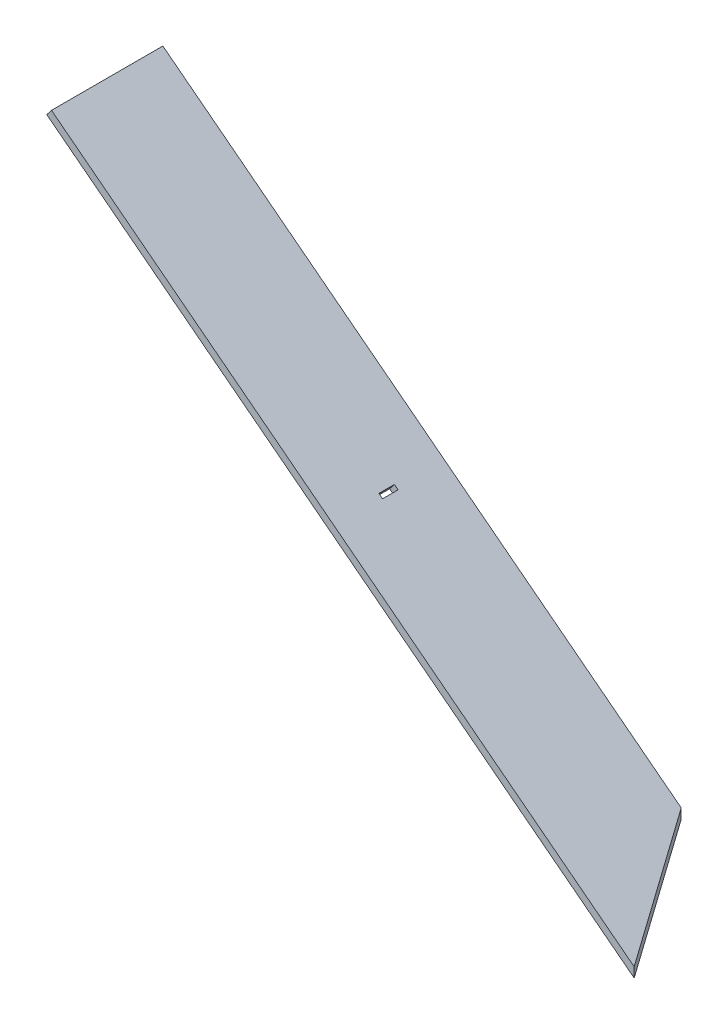
ISO-10303-21;
HEADER;
FILE_DESCRIPTION(('STEP AP214'),'2;1');
FILE_NAME('part.step','',(''),(''),'','','');
FILE_SCHEMA(('AUTOMOTIVE_DESIGN { 1 0 10303 214 1 1 1 1 }'));
ENDSEC;
DATA;
#1=APPLICATION_CONTEXT('core data for automotive mechanical design processes');
#2=APPLICATION_PROTOCOL_DEFINITION('international standard','automotive_design',2000,#1);
#3=PRODUCT_CONTEXT('',#1,'mechanical');
#4=PRODUCT('Part','Part','',(#3));
#5=PRODUCT_RELATED_PRODUCT_CATEGORY('part','',(#4));
#6=PRODUCT_DEFINITION_FORMATION('','',#4);
#7=PRODUCT_DEFINITION_CONTEXT('part definition',#1,'design');
#8=PRODUCT_DEFINITION('design','',#6,#7);
#9=PRODUCT_DEFINITION_SHAPE('','',#8);
#10=(LENGTH_UNIT() NAMED_UNIT(*) SI_UNIT(.MILLI.,.METRE.));
#11=(NAMED_UNIT(*) PLANE_ANGLE_UNIT() SI_UNIT($,.RADIAN.));
#12=(NAMED_UNIT(*) SI_UNIT($,.STERADIAN.) SOLID_ANGLE_UNIT());
#13=UNCERTAINTY_MEASURE_WITH_UNIT(LENGTH_MEASURE(1.E-05),#10,'distance_accuracy_value','');
#14=(GEOMETRIC_REPRESENTATION_CONTEXT(3) GLOBAL_UNCERTAINTY_ASSIGNED_CONTEXT((#13)) GLOBAL_UNIT_ASSIGNED_CONTEXT((#10,
#11,#12)) REPRESENTATION_CONTEXT('',''));
#15=CARTESIAN_POINT('',(0.,0.,0.));
#16=DIRECTION('',(0.,0.,1.));
#17=DIRECTION('',(1.,0.,0.));
#18=AXIS2_PLACEMENT_3D('',#15,#16,#17);
#19=CARTESIAN_POINT('',(0.,0.,-240.2));
#20=DIRECTION('',(-0.611527040185827,-0.791223532967493,0.));
#21=DIRECTION('',(0.791223532967493,-0.611527040185827,0.));
#22=AXIS2_PLACEMENT_3D('',#19,#20,#21);
#23=PLANE('',#22);
#24=DIRECTION('',(0.,0.,1.));
#25=VECTOR('',#24,1.);
#26=CARTESIAN_POINT('',(-196.842346713492,152.137054389003,-240.2));
#27=LINE('',#26,#25);
#28=CARTESIAN_POINT('',(-196.842346713492,152.137054389002,-209.17));
#29=VERTEX_POINT('',#28);
#30=CARTESIAN_POINT('',(-196.842346713492,152.137054389002,-199.17));
#31=VERTEX_POINT('',#30);
#32=EDGE_CURVE('E319',#29,#31,#27,.T.);
#33=ORIENTED_EDGE('',*,*,#32,.F.);
#34=DIRECTION('',(0.791223532967493,-0.611527040185827,0.));
#35=VECTOR('',#34,1.);
#36=CARTESIAN_POINT('',(0.,0.,-209.17));
#37=LINE('',#36,#35);
#38=CARTESIAN_POINT('',(-199.216017312395,153.97163550956,-209.17));
#39=VERTEX_POINT('',#38);
#40=EDGE_CURVE('E327',#39,#29,#37,.T.);
#41=ORIENTED_EDGE('',*,*,#40,.F.);
#42=DIRECTION('',(0.,0.,-1.));
#43=VECTOR('',#42,1.);
#44=CARTESIAN_POINT('',(-199.216017312395,153.97163550956,-240.2));
#45=LINE('',#44,#43);
#46=CARTESIAN_POINT('',(-199.216017312395,153.97163550956,-199.17));
#47=VERTEX_POINT('',#46);
#48=EDGE_CURVE('E261',#47,#39,#45,.T.);
#49=ORIENTED_EDGE('',*,*,#48,.F.);
#50=DIRECTION('',(-0.791223532967493,0.611527040185827,0.));
#51=VECTOR('',#50,1.);
#52=CARTESIAN_POINT('',(0.,0.,-199.17));
#53=LINE('',#52,#51);
#54=EDGE_CURVE('E322',#31,#47,#53,.T.);
#55=ORIENTED_EDGE('',*,*,#54,.F.);
#56=EDGE_LOOP('',(#33,#41,#49,#55));
#57=FACE_BOUND('',#56,.T.);
#58=DIRECTION('',(0.791223532967493,-0.611527040185827,0.));
#59=VECTOR('',#58,1.);
#60=CARTESIAN_POINT('',(0.,0.,-240.2));
#61=LINE('',#60,#59);
#62=CARTESIAN_POINT('',(-380.024662884291,293.716437401255,-240.2));
#63=VERTEX_POINT('',#62);
#64=CARTESIAN_POINT('',(-41.6038603978046,32.1551174216896,-240.2));
#65=VERTEX_POINT('',#64);
#66=EDGE_CURVE('E291',#63,#65,#61,.T.);
#67=ORIENTED_EDGE('',*,*,#66,.T.);
#68=DIRECTION('',(0.466386479127684,-0.360464434233857,0.807805077812307));
#69=VECTOR('',#68,1.);
#70=CARTESIAN_POINT('',(-27.1485593184527,20.9827911248499,-215.162684091857));
#71=LINE('',#70,#69);
#72=CARTESIAN_POINT('',(0.,0.,-168.14));
#73=VERTEX_POINT('',#72);
#74=EDGE_CURVE('E307',#65,#73,#71,.T.);
#75=ORIENTED_EDGE('',*,*,#74,.T.);
#76=DIRECTION('',(-0.791223532967494,0.611527040185827,0.));
#77=VECTOR('',#76,1.);
#78=CARTESIAN_POINT('',(0.,0.,-168.14));
#79=LINE('',#78,#77);
#80=CARTESIAN_POINT('',(-380.024662884291,293.716437401255,-168.14));
#81=VERTEX_POINT('',#80);
#82=EDGE_CURVE('E295',#73,#81,#79,.T.);
#83=ORIENTED_EDGE('',*,*,#82,.T.);
#84=DIRECTION('',(0.,0.,1.));
#85=VECTOR('',#84,1.);
#86=CARTESIAN_POINT('',(-380.024662884291,293.716437401255,-240.2));
#87=LINE('',#86,#85);
#88=EDGE_CURVE('E276',#63,#81,#87,.T.);
#89=ORIENTED_EDGE('',*,*,#88,.F.);
#90=EDGE_LOOP('',(#67,#75,#83,#89));
#91=FACE_BOUND('',#90,.T.);
#92=ADVANCED_FACE('F186',(#57,#91),#23,.T.);
#93=CARTESIAN_POINT('',(0.,6.31932670309673,-240.2));
#94=DIRECTION('',(0.611527040185827,0.791223532967494,0.));
#95=DIRECTION('',(-0.791223532967494,0.611527040185827,0.));
#96=AXIS2_PLACEMENT_3D('',#93,#94,#95);
#97=PLANE('',#96);
#98=DIRECTION('',(0.,0.,-1.));
#99=VECTOR('',#98,1.);
#100=CARTESIAN_POINT('',(-193.784711512563,156.09317205384,-240.2));
#101=LINE('',#100,#99);
#102=CARTESIAN_POINT('',(-193.784711512563,156.09317205384,-199.17));
#103=VERTEX_POINT('',#102);
#104=CARTESIAN_POINT('',(-193.784711512563,156.09317205384,-209.17));
#105=VERTEX_POINT('',#104);
#106=EDGE_CURVE('E13',#103,#105,#101,.T.);
#107=ORIENTED_EDGE('',*,*,#106,.F.);
#108=DIRECTION('',(0.791223532967494,-0.611527040185827,0.));
#109=VECTOR('',#108,1.);
#110=CARTESIAN_POINT('',(0.,6.31932670309673,-199.17));
#111=LINE('',#110,#109);
#112=CARTESIAN_POINT('',(-196.158382111466,157.927753174397,-199.17));
#113=VERTEX_POINT('',#112);
#114=EDGE_CURVE('E194',#113,#103,#111,.T.);
#115=ORIENTED_EDGE('',*,*,#114,.F.);
#116=DIRECTION('',(0.,0.,1.));
#117=VECTOR('',#116,1.);
#118=CARTESIAN_POINT('',(-196.158382111466,157.927753174397,-240.2));
#119=LINE('',#118,#117);
#120=CARTESIAN_POINT('',(-196.158382111466,157.927753174397,-209.17));
#121=VERTEX_POINT('',#120);
#122=EDGE_CURVE('E253',#121,#113,#119,.T.);
#123=ORIENTED_EDGE('',*,*,#122,.F.);
#124=DIRECTION('',(-0.791223532967494,0.611527040185827,0.));
#125=VECTOR('',#124,1.);
#126=CARTESIAN_POINT('',(0.,6.31932670309673,-209.17));
#127=LINE('',#126,#125);
#128=EDGE_CURVE('E247',#105,#121,#127,.T.);
#129=ORIENTED_EDGE('',*,*,#128,.F.);
#130=EDGE_LOOP('',(#107,#115,#123,#129));
#131=FACE_BOUND('',#130,.T.);
#132=DIRECTION('',(0.791223532967494,-0.611527040185827,0.));
#133=VECTOR('',#132,1.);
#134=CARTESIAN_POINT('',(0.,6.31932670309672,-168.14));
#135=LINE('',#134,#133);
#136=CARTESIAN_POINT('',(-376.967027683362,297.672555066093,-168.14));
#137=VERTEX_POINT('',#136);
#138=CARTESIAN_POINT('',(0.,6.31932670309673,-168.14));
#139=VERTEX_POINT('',#138);
#140=EDGE_CURVE('E303',#137,#139,#135,.T.);
#141=ORIENTED_EDGE('',*,*,#140,.T.);
#142=DIRECTION('',(-0.466386479127684,0.360464434233857,-0.807805077812307));
#143=VECTOR('',#142,1.);
#144=CARTESIAN_POINT('',(-27.1485593184527,27.3021178279466,-215.162684091857));
#145=LINE('',#144,#143);
#146=CARTESIAN_POINT('',(-41.6038603978046,38.4744441247863,-240.2));
#147=VERTEX_POINT('',#146);
#148=EDGE_CURVE('E311',#139,#147,#145,.T.);
#149=ORIENTED_EDGE('',*,*,#148,.T.);
#150=DIRECTION('',(-0.791223532967493,0.611527040185827,0.));
#151=VECTOR('',#150,1.);
#152=CARTESIAN_POINT('',(0.,6.31932670309673,-240.2));
#153=LINE('',#152,#151);
#154=CARTESIAN_POINT('',(-376.967027683362,297.672555066093,-240.2));
#155=VERTEX_POINT('',#154);
#156=EDGE_CURVE('E288',#147,#155,#153,.T.);
#157=ORIENTED_EDGE('',*,*,#156,.T.);
#158=DIRECTION('',(0.,0.,1.));
#159=VECTOR('',#158,1.);
#160=CARTESIAN_POINT('',(-376.967027683362,297.672555066093,-240.2));
#161=LINE('',#160,#159);
#162=EDGE_CURVE('E277',#155,#137,#161,.T.);
#163=ORIENTED_EDGE('',*,*,#162,.T.);
#164=EDGE_LOOP('',(#141,#149,#157,#163));
#165=FACE_BOUND('',#164,.T.);
#166=ADVANCED_FACE('F267',(#131,#165),#97,.T.);
#167=CARTESIAN_POINT('',(0.,0.,-240.2));
#168=DIRECTION('',(0.,0.,-1.));
#169=DIRECTION('',(-1.,0.,0.));
#170=AXIS2_PLACEMENT_3D('',#167,#168,#169);
#171=PLANE('',#170);
#172=ORIENTED_EDGE('',*,*,#156,.F.);
#173=DIRECTION('',(0.,-1.,0.));
#174=VECTOR('',#173,1.);
#175=CARTESIAN_POINT('',(-41.6038603978046,297.672555066093,-240.2));
#176=LINE('',#175,#174);
#177=EDGE_CURVE('E315',#147,#65,#176,.T.);
#178=ORIENTED_EDGE('',*,*,#177,.T.);
#179=ORIENTED_EDGE('',*,*,#66,.F.);
#180=DIRECTION('',(-0.611527040185826,-0.791223532967494,0.));
#181=VECTOR('',#180,1.);
#182=CARTESIAN_POINT('',(-380.024662884291,293.716437401255,-240.2));
#183=LINE('',#182,#181);
#184=EDGE_CURVE('E281',#155,#63,#183,.T.);
#185=ORIENTED_EDGE('',*,*,#184,.F.);
#186=EDGE_LOOP('',(#172,#178,#179,#185));
#187=FACE_BOUND('',#186,.T.);
#188=ADVANCED_FACE('F352',(#187),#171,.T.);
#189=CARTESIAN_POINT('',(0.,297.672555066093,-168.14));
#190=DIRECTION('',(0.,0.,1.));
#191=DIRECTION('',(1.,0.,0.));
#192=AXIS2_PLACEMENT_3D('',#189,#190,#191);
#193=PLANE('',#192);
#194=ORIENTED_EDGE('',*,*,#82,.F.);
#195=DIRECTION('',(0.,1.,0.));
#196=VECTOR('',#195,1.);
#197=CARTESIAN_POINT('',(0.,297.672555066093,-168.14));
#198=LINE('',#197,#196);
#199=EDGE_CURVE('E254',#73,#139,#198,.T.);
#200=ORIENTED_EDGE('',*,*,#199,.T.);
#201=ORIENTED_EDGE('',*,*,#140,.F.);
#202=DIRECTION('',(0.611527040185826,0.791223532967494,0.));
#203=VECTOR('',#202,1.);
#204=CARTESIAN_POINT('',(-380.024662884291,293.716437401255,-168.14));
#205=LINE('',#204,#203);
#206=EDGE_CURVE('E299',#81,#137,#205,.T.);
#207=ORIENTED_EDGE('',*,*,#206,.F.);
#208=EDGE_LOOP('',(#194,#200,#201,#207));
#209=FACE_BOUND('',#208,.T.);
#210=ADVANCED_FACE('F359',(#209),#193,.T.);
#211=CARTESIAN_POINT('',(-380.024662884291,293.716437401255,-240.2));
#212=DIRECTION('',(-0.791223532967494,0.611527040185826,0.));
#213=DIRECTION('',(-0.611527040185826,-0.791223532967494,0.));
#214=AXIS2_PLACEMENT_3D('',#211,#212,#213);
#215=PLANE('',#214);
#216=ORIENTED_EDGE('',*,*,#88,.T.);
#217=ORIENTED_EDGE('',*,*,#206,.T.);
#218=ORIENTED_EDGE('',*,*,#162,.F.);
#219=ORIENTED_EDGE('',*,*,#184,.T.);
#220=EDGE_LOOP('',(#216,#217,#218,#219));
#221=FACE_BOUND('',#220,.T.);
#222=ADVANCED_FACE('F355',(#221),#215,.T.);
#223=CARTESIAN_POINT('',(72.8067556961579,297.672555066093,-42.0350000000002));
#224=DIRECTION('',(0.866025403784438,0.,-0.500000000000001));
#225=DIRECTION('',(-0.500000000000001,0.,-0.866025403784438));
#226=AXIS2_PLACEMENT_3D('',#223,#224,#225);
#227=PLANE('',#226);
#228=ORIENTED_EDGE('',*,*,#177,.F.);
#229=ORIENTED_EDGE('',*,*,#148,.F.);
#230=ORIENTED_EDGE('',*,*,#199,.F.);
#231=ORIENTED_EDGE('',*,*,#74,.F.);
#232=EDGE_LOOP('',(#228,#229,#230,#231));
#233=FACE_BOUND('',#232,.T.);
#234=ADVANCED_FACE('F357',(#233),#227,.T.);
#235=CARTESIAN_POINT('',(-338.958391710736,-31.739621252221,-199.17));
#236=DIRECTION('',(0.791223532967493,-0.611527040185827,0.));
#237=DIRECTION('',(0.611527040185827,0.791223532967493,0.));
#238=AXIS2_PLACEMENT_3D('',#235,#236,#237);
#239=PLANE('',#238);
#240=ORIENTED_EDGE('',*,*,#32,.T.);
#241=DIRECTION('',(0.611527040185827,0.791223532967493,0.));
#242=VECTOR('',#241,1.);
#243=CARTESIAN_POINT('',(-338.958391710736,-31.739621252221,-199.17));
#244=LINE('',#243,#242);
#245=EDGE_CURVE('E330',#31,#103,#244,.T.);
#246=ORIENTED_EDGE('',*,*,#245,.T.);
#247=ORIENTED_EDGE('',*,*,#106,.T.);
#248=DIRECTION('',(0.611527040185827,0.791223532967493,0.));
#249=VECTOR('',#248,1.);
#250=CARTESIAN_POINT('',(-338.958391710736,-31.739621252221,-209.17));
#251=LINE('',#250,#249);
#252=EDGE_CURVE('E206',#29,#105,#251,.T.);
#253=ORIENTED_EDGE('',*,*,#252,.F.);
#254=EDGE_LOOP('',(#240,#246,#247,#253));
#255=FACE_BOUND('',#254,.T.);
#256=ADVANCED_FACE('F339',(#255),#239,.F.);
#257=CARTESIAN_POINT('',(-341.332062309639,-29.9050401316635,-199.17));
#258=DIRECTION('',(0.,0.,1.));
#259=DIRECTION('',(1.,0.,0.));
#260=AXIS2_PLACEMENT_3D('',#257,#258,#259);
#261=PLANE('',#260);
#262=ORIENTED_EDGE('',*,*,#54,.T.);
#263=DIRECTION('',(0.611527040185827,0.791223532967493,0.));
#264=VECTOR('',#263,1.);
#265=CARTESIAN_POINT('',(-341.332062309639,-29.9050401316635,-199.17));
#266=LINE('',#265,#264);
#267=EDGE_CURVE('E264',#47,#113,#266,.T.);
#268=ORIENTED_EDGE('',*,*,#267,.T.);
#269=ORIENTED_EDGE('',*,*,#114,.T.);
#270=ORIENTED_EDGE('',*,*,#245,.F.);
#271=EDGE_LOOP('',(#262,#268,#269,#270));
#272=FACE_BOUND('',#271,.T.);
#273=ADVANCED_FACE('F343',(#272),#261,.F.);
#274=CARTESIAN_POINT('',(-341.332062309639,-29.9050401316635,-199.17));
#275=DIRECTION('',(-0.791223532967493,0.611527040185827,0.));
#276=DIRECTION('',(-0.611527040185827,-0.791223532967493,0.));
#277=AXIS2_PLACEMENT_3D('',#274,#275,#276);
#278=PLANE('',#277);
#279=ORIENTED_EDGE('',*,*,#48,.T.);
#280=DIRECTION('',(0.611527040185827,0.791223532967493,0.));
#281=VECTOR('',#280,1.);
#282=CARTESIAN_POINT('',(-341.332062309639,-29.9050401316635,-209.17));
#283=LINE('',#282,#281);
#284=EDGE_CURVE('E201',#39,#121,#283,.T.);
#285=ORIENTED_EDGE('',*,*,#284,.T.);
#286=ORIENTED_EDGE('',*,*,#122,.T.);
#287=ORIENTED_EDGE('',*,*,#267,.F.);
#288=EDGE_LOOP('',(#279,#285,#286,#287));
#289=FACE_BOUND('',#288,.T.);
#290=ADVANCED_FACE('F257',(#289),#278,.F.);
#291=CARTESIAN_POINT('',(-341.332062309639,-29.9050401316635,-209.17));
#292=DIRECTION('',(0.,0.,-1.));
#293=DIRECTION('',(-1.,0.,0.));
#294=AXIS2_PLACEMENT_3D('',#291,#292,#293);
#295=PLANE('',#294);
#296=ORIENTED_EDGE('',*,*,#40,.T.);
#297=ORIENTED_EDGE('',*,*,#252,.T.);
#298=ORIENTED_EDGE('',*,*,#128,.T.);
#299=ORIENTED_EDGE('',*,*,#284,.F.);
#300=EDGE_LOOP('',(#296,#297,#298,#299));
#301=FACE_BOUND('',#300,.T.);
#302=ADVANCED_FACE('F248',(#301),#295,.F.);
#303=CLOSED_SHELL('',(#92,#166,#188,#210,#222,#234,#256,#273,#290,#302));
#304=MANIFOLD_SOLID_BREP('B2',#303);
#305=ADVANCED_BREP_SHAPE_REPRESENTATION('',(#18,#304),#14);
#306=SHAPE_DEFINITION_REPRESENTATION(#9,#305);
ENDSEC;
END-ISO-10303-21;
